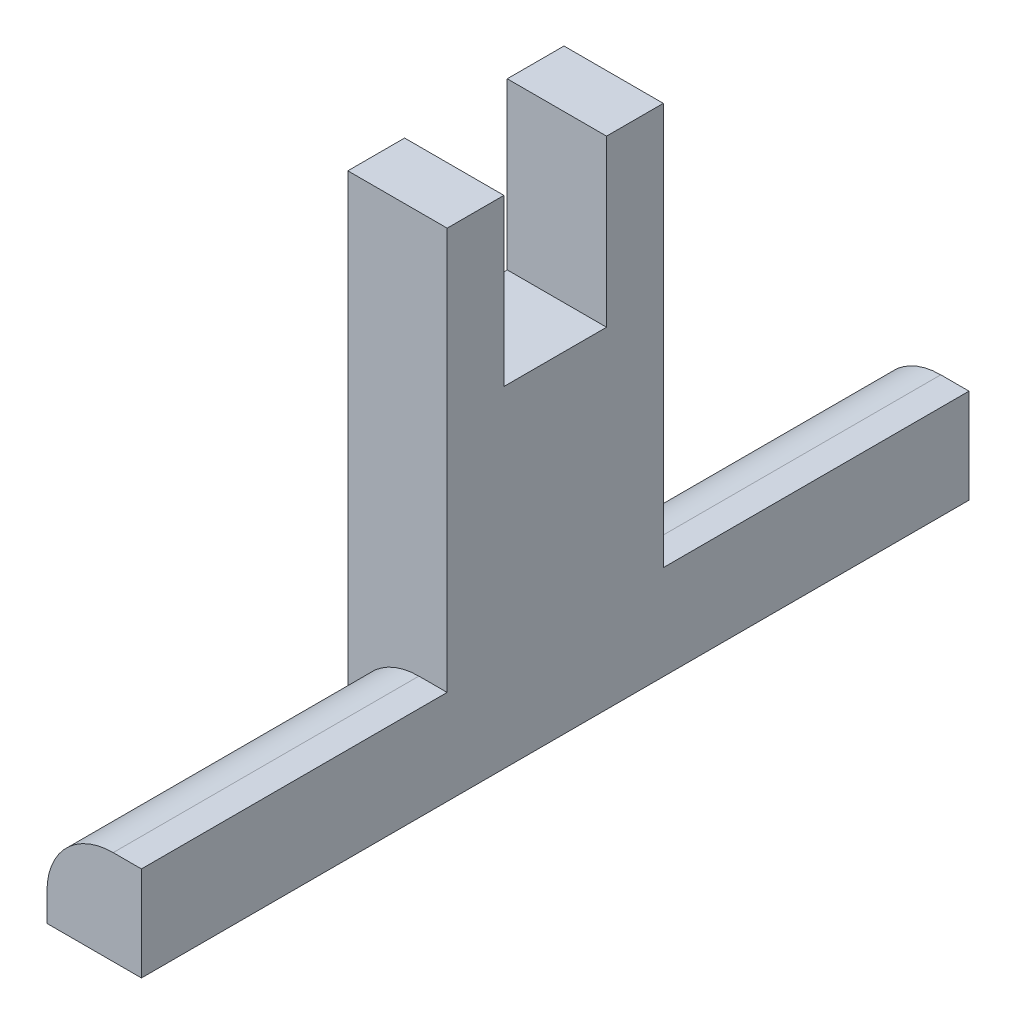
ISO-10303-21;
HEADER;
FILE_DESCRIPTION(('STEP AP214'),'2;1');
FILE_NAME('part.step','',(''),(''),'','','');
FILE_SCHEMA(('AUTOMOTIVE_DESIGN { 1 0 10303 214 1 1 1 1 }'));
ENDSEC;
DATA;
#1=APPLICATION_CONTEXT('core data for automotive mechanical design processes');
#2=APPLICATION_PROTOCOL_DEFINITION('international standard','automotive_design',2000,#1);
#3=PRODUCT_CONTEXT('',#1,'mechanical');
#4=PRODUCT('Part','Part','',(#3));
#5=PRODUCT_RELATED_PRODUCT_CATEGORY('part','',(#4));
#6=PRODUCT_DEFINITION_FORMATION('','',#4);
#7=PRODUCT_DEFINITION_CONTEXT('part definition',#1,'design');
#8=PRODUCT_DEFINITION('design','',#6,#7);
#9=PRODUCT_DEFINITION_SHAPE('','',#8);
#10=(LENGTH_UNIT() NAMED_UNIT(*) SI_UNIT(.MILLI.,.METRE.));
#11=(NAMED_UNIT(*) PLANE_ANGLE_UNIT() SI_UNIT($,.RADIAN.));
#12=(NAMED_UNIT(*) SI_UNIT($,.STERADIAN.) SOLID_ANGLE_UNIT());
#13=UNCERTAINTY_MEASURE_WITH_UNIT(LENGTH_MEASURE(1.E-05),#10,'distance_accuracy_value','');
#14=(GEOMETRIC_REPRESENTATION_CONTEXT(3) GLOBAL_UNCERTAINTY_ASSIGNED_CONTEXT((#13)) GLOBAL_UNIT_ASSIGNED_CONTEXT((#10,
#11,#12)) REPRESENTATION_CONTEXT('',''));
#15=CARTESIAN_POINT('',(0.,0.,0.));
#16=DIRECTION('',(0.,0.,1.));
#17=DIRECTION('',(1.,0.,0.));
#18=AXIS2_PLACEMENT_3D('',#15,#16,#17);
#19=CARTESIAN_POINT('',(-6.,0.,-6.5301128643398));
#20=DIRECTION('',(0.,0.,-1.));
#21=DIRECTION('',(-1.,0.,0.));
#22=AXIS2_PLACEMENT_3D('',#19,#20,#21);
#23=PLANE('',#22);
#24=DIRECTION('',(0.,1.,0.));
#25=VECTOR('',#24,1.);
#26=CARTESIAN_POINT('',(0.,0.,-6.5301128643398));
#27=LINE('',#26,#25);
#28=CARTESIAN_POINT('',(0.,-14.2928085357805,-6.5301128643398));
#29=VERTEX_POINT('',#28);
#30=CARTESIAN_POINT('',(0.,10.,-6.5301128643398));
#31=VERTEX_POINT('',#30);
#32=EDGE_CURVE('E216',#29,#31,#27,.T.);
#33=ORIENTED_EDGE('',*,*,#32,.F.);
#34=DIRECTION('',(-1.,0.,0.));
#35=VECTOR('',#34,1.);
#36=CARTESIAN_POINT('',(-6.,-14.2928085357805,-6.5301128643398));
#37=LINE('',#36,#35);
#38=CARTESIAN_POINT('',(-1.70719146421949,-14.2928085357805,-6.5301128643398));
#39=VERTEX_POINT('',#38);
#40=EDGE_CURVE('E150',#29,#39,#37,.T.);
#41=ORIENTED_EDGE('',*,*,#40,.T.);
#42=CARTESIAN_POINT('',(-1.70719146421949,-18.2928085357805,-6.5301128643398));
#43=DIRECTION('',(0.,0.,-1.));
#44=DIRECTION('',(-1.,0.,0.));
#45=AXIS2_PLACEMENT_3D('',#42,#43,#44);
#46=CIRCLE('',#45,4.);
#47=CARTESIAN_POINT('',(-5.70719146421949,-18.2928085357805,-6.5301128643398));
#48=VERTEX_POINT('',#47);
#49=EDGE_CURVE('E209',#39,#48,#46,.F.);
#50=ORIENTED_EDGE('',*,*,#49,.T.);
#51=DIRECTION('',(0.,-1.,0.));
#52=VECTOR('',#51,1.);
#53=CARTESIAN_POINT('',(-5.70719146421949,0.,-6.5301128643398));
#54=LINE('',#53,#52);
#55=CARTESIAN_POINT('',(-5.70719146421949,-20.,-6.5301128643398));
#56=VERTEX_POINT('',#55);
#57=EDGE_CURVE('E206',#48,#56,#54,.T.);
#58=ORIENTED_EDGE('',*,*,#57,.T.);
#59=DIRECTION('',(1.,0.,0.));
#60=VECTOR('',#59,1.);
#61=CARTESIAN_POINT('',(-6.,-20.,-6.5301128643398));
#62=LINE('',#61,#60);
#63=CARTESIAN_POINT('',(-6.,-20.,-6.5301128643398));
#64=VERTEX_POINT('',#63);
#65=EDGE_CURVE('E255',#64,#56,#62,.T.);
#66=ORIENTED_EDGE('',*,*,#65,.F.);
#67=DIRECTION('',(0.,1.,0.));
#68=VECTOR('',#67,1.);
#69=CARTESIAN_POINT('',(-6.,0.,-6.5301128643398));
#70=LINE('',#69,#68);
#71=CARTESIAN_POINT('',(-6.,10.,-6.5301128643398));
#72=VERTEX_POINT('',#71);
#73=EDGE_CURVE('E231',#64,#72,#70,.T.);
#74=ORIENTED_EDGE('',*,*,#73,.T.);
#75=DIRECTION('',(1.,0.,0.));
#76=VECTOR('',#75,1.);
#77=CARTESIAN_POINT('',(-6.,10.,-6.5301128643398));
#78=LINE('',#77,#76);
#79=EDGE_CURVE('E252',#72,#31,#78,.T.);
#80=ORIENTED_EDGE('',*,*,#79,.T.);
#81=EDGE_LOOP('',(#33,#41,#50,#58,#66,#74,#80));
#82=FACE_BOUND('',#81,.T.);
#83=ADVANCED_FACE('F36',(#82),#23,.T.);
#84=CARTESIAN_POINT('',(-6.,0.,6.5301128643398));
#85=DIRECTION('',(0.,0.,1.));
#86=DIRECTION('',(0.,-1.,0.));
#87=AXIS2_PLACEMENT_3D('',#84,#85,#86);
#88=PLANE('',#87);
#89=CARTESIAN_POINT('',(-1.70719146421949,-18.2928085357805,6.5301128643398));
#90=DIRECTION('',(0.,0.,1.));
#91=DIRECTION('',(0.,-1.,0.));
#92=AXIS2_PLACEMENT_3D('',#89,#90,#91);
#93=CIRCLE('',#92,4.);
#94=CARTESIAN_POINT('',(-5.70719146421949,-18.2928085357805,6.5301128643398));
#95=VERTEX_POINT('',#94);
#96=CARTESIAN_POINT('',(-1.70719146421949,-14.2928085357805,6.5301128643398));
#97=VERTEX_POINT('',#96);
#98=EDGE_CURVE('E11',#95,#97,#93,.F.);
#99=ORIENTED_EDGE('',*,*,#98,.T.);
#100=DIRECTION('',(1.,0.,0.));
#101=VECTOR('',#100,1.);
#102=CARTESIAN_POINT('',(-6.,-14.2928085357805,6.5301128643398));
#103=LINE('',#102,#101);
#104=CARTESIAN_POINT('',(0.,-14.2928085357805,6.5301128643398));
#105=VERTEX_POINT('',#104);
#106=EDGE_CURVE('E203',#97,#105,#103,.T.);
#107=ORIENTED_EDGE('',*,*,#106,.T.);
#108=DIRECTION('',(0.,-1.,0.));
#109=VECTOR('',#108,1.);
#110=CARTESIAN_POINT('',(0.,0.,6.5301128643398));
#111=LINE('',#110,#109);
#112=CARTESIAN_POINT('',(0.,10.,6.5301128643398));
#113=VERTEX_POINT('',#112);
#114=EDGE_CURVE('E247',#113,#105,#111,.T.);
#115=ORIENTED_EDGE('',*,*,#114,.F.);
#116=DIRECTION('',(1.,0.,0.));
#117=VECTOR('',#116,1.);
#118=CARTESIAN_POINT('',(-6.,10.,6.5301128643398));
#119=LINE('',#118,#117);
#120=CARTESIAN_POINT('',(-6.,10.,6.5301128643398));
#121=VERTEX_POINT('',#120);
#122=EDGE_CURVE('E260',#121,#113,#119,.T.);
#123=ORIENTED_EDGE('',*,*,#122,.F.);
#124=DIRECTION('',(0.,-1.,0.));
#125=VECTOR('',#124,1.);
#126=CARTESIAN_POINT('',(-6.,0.,6.5301128643398));
#127=LINE('',#126,#125);
#128=CARTESIAN_POINT('',(-6.,-20.,6.5301128643398));
#129=VERTEX_POINT('',#128);
#130=EDGE_CURVE('E225',#121,#129,#127,.T.);
#131=ORIENTED_EDGE('',*,*,#130,.T.);
#132=DIRECTION('',(1.,0.,0.));
#133=VECTOR('',#132,1.);
#134=CARTESIAN_POINT('',(-6.,-20.,6.5301128643398));
#135=LINE('',#134,#133);
#136=CARTESIAN_POINT('',(-5.70719146421949,-20.,6.5301128643398));
#137=VERTEX_POINT('',#136);
#138=EDGE_CURVE('E258',#129,#137,#135,.T.);
#139=ORIENTED_EDGE('',*,*,#138,.T.);
#140=DIRECTION('',(0.,1.,0.));
#141=VECTOR('',#140,1.);
#142=CARTESIAN_POINT('',(-5.70719146421949,0.,6.5301128643398));
#143=LINE('',#142,#141);
#144=EDGE_CURVE('E44',#137,#95,#143,.T.);
#145=ORIENTED_EDGE('',*,*,#144,.T.);
#146=EDGE_LOOP('',(#99,#107,#115,#123,#131,#139,#145));
#147=FACE_BOUND('',#146,.T.);
#148=ADVANCED_FACE('F295',(#147),#88,.T.);
#149=CARTESIAN_POINT('',(-6.,10.,0.));
#150=DIRECTION('',(0.,-1.,0.));
#151=DIRECTION('',(0.,0.,-1.));
#152=AXIS2_PLACEMENT_3D('',#149,#150,#151);
#153=PLANE('',#152);
#154=DIRECTION('',(0.,0.,-1.));
#155=VECTOR('',#154,1.);
#156=CARTESIAN_POINT('',(0.,10.,0.));
#157=LINE('',#156,#155);
#158=CARTESIAN_POINT('',(0.,10.,-3.1));
#159=VERTEX_POINT('',#158);
#160=EDGE_CURVE('E212',#159,#31,#157,.T.);
#161=ORIENTED_EDGE('',*,*,#160,.T.);
#162=ORIENTED_EDGE('',*,*,#79,.F.);
#163=DIRECTION('',(0.,0.,-1.));
#164=VECTOR('',#163,1.);
#165=CARTESIAN_POINT('',(-6.,10.,0.));
#166=LINE('',#165,#164);
#167=CARTESIAN_POINT('',(-6.,10.,-3.1));
#168=VERTEX_POINT('',#167);
#169=EDGE_CURVE('E213',#168,#72,#166,.T.);
#170=ORIENTED_EDGE('',*,*,#169,.F.);
#171=DIRECTION('',(1.,0.,0.));
#172=VECTOR('',#171,1.);
#173=CARTESIAN_POINT('',(-6.,10.,-3.1));
#174=LINE('',#173,#172);
#175=EDGE_CURVE('E234',#168,#159,#174,.T.);
#176=ORIENTED_EDGE('',*,*,#175,.T.);
#177=EDGE_LOOP('',(#161,#162,#170,#176));
#178=FACE_BOUND('',#177,.T.);
#179=ADVANCED_FACE('F38',(#178),#153,.F.);
#180=CARTESIAN_POINT('',(-6.,-20.,0.));
#181=DIRECTION('',(0.,-1.,0.));
#182=DIRECTION('',(0.,0.,-1.));
#183=AXIS2_PLACEMENT_3D('',#180,#181,#182);
#184=PLANE('',#183);
#185=DIRECTION('',(0.,0.,-1.));
#186=VECTOR('',#185,1.);
#187=CARTESIAN_POINT('',(-5.70719146421949,-20.,25.));
#188=LINE('',#187,#186);
#189=CARTESIAN_POINT('',(-5.70719146421949,-20.,25.));
#190=VERTEX_POINT('',#189);
#191=EDGE_CURVE('E192',#190,#137,#188,.T.);
#192=ORIENTED_EDGE('',*,*,#191,.T.);
#193=ORIENTED_EDGE('',*,*,#138,.F.);
#194=DIRECTION('',(0.,0.,-1.));
#195=VECTOR('',#194,1.);
#196=CARTESIAN_POINT('',(-6.,-20.,0.));
#197=LINE('',#196,#195);
#198=EDGE_CURVE('E228',#129,#64,#197,.T.);
#199=ORIENTED_EDGE('',*,*,#198,.T.);
#200=ORIENTED_EDGE('',*,*,#65,.T.);
#201=CARTESIAN_POINT('',(-5.70719146421949,-20.,-25.));
#202=VERTEX_POINT('',#201);
#203=EDGE_CURVE('E191',#56,#202,#188,.T.);
#204=ORIENTED_EDGE('',*,*,#203,.T.);
#205=DIRECTION('',(1.,0.,0.));
#206=VECTOR('',#205,1.);
#207=CARTESIAN_POINT('',(0.,-20.,-25.));
#208=LINE('',#207,#206);
#209=CARTESIAN_POINT('',(0.,-20.,-25.));
#210=VERTEX_POINT('',#209);
#211=EDGE_CURVE('E177',#202,#210,#208,.T.);
#212=ORIENTED_EDGE('',*,*,#211,.T.);
#213=DIRECTION('',(0.,0.,-1.));
#214=VECTOR('',#213,1.);
#215=CARTESIAN_POINT('',(0.,-20.,0.));
#216=LINE('',#215,#214);
#217=CARTESIAN_POINT('',(0.,-20.,25.));
#218=VERTEX_POINT('',#217);
#219=EDGE_CURVE('E170',#218,#210,#216,.T.);
#220=ORIENTED_EDGE('',*,*,#219,.F.);
#221=DIRECTION('',(1.,0.,0.));
#222=VECTOR('',#221,1.);
#223=CARTESIAN_POINT('',(0.,-20.,25.));
#224=LINE('',#223,#222);
#225=EDGE_CURVE('E188',#190,#218,#224,.T.);
#226=ORIENTED_EDGE('',*,*,#225,.F.);
#227=EDGE_LOOP('',(#192,#193,#199,#200,#204,#212,#220,#226));
#228=FACE_BOUND('',#227,.T.);
#229=ADVANCED_FACE('F307',(#228),#184,.T.);
#230=CARTESIAN_POINT('',(-6.,10.,0.));
#231=DIRECTION('',(0.,-1.,0.));
#232=DIRECTION('',(0.,0.,-1.));
#233=AXIS2_PLACEMENT_3D('',#230,#231,#232);
#234=PLANE('',#233);
#235=DIRECTION('',(0.,0.,-1.));
#236=VECTOR('',#235,1.);
#237=CARTESIAN_POINT('',(0.,10.,0.));
#238=LINE('',#237,#236);
#239=CARTESIAN_POINT('',(0.,10.,3.1));
#240=VERTEX_POINT('',#239);
#241=EDGE_CURVE('E245',#113,#240,#238,.T.);
#242=ORIENTED_EDGE('',*,*,#241,.T.);
#243=DIRECTION('',(1.,0.,0.));
#244=VECTOR('',#243,1.);
#245=CARTESIAN_POINT('',(-6.,10.,3.1));
#246=LINE('',#245,#244);
#247=CARTESIAN_POINT('',(-6.,10.,3.1));
#248=VERTEX_POINT('',#247);
#249=EDGE_CURVE('E262',#248,#240,#246,.T.);
#250=ORIENTED_EDGE('',*,*,#249,.F.);
#251=DIRECTION('',(0.,0.,-1.));
#252=VECTOR('',#251,1.);
#253=CARTESIAN_POINT('',(-6.,10.,0.));
#254=LINE('',#253,#252);
#255=EDGE_CURVE('E223',#121,#248,#254,.T.);
#256=ORIENTED_EDGE('',*,*,#255,.F.);
#257=ORIENTED_EDGE('',*,*,#122,.T.);
#258=EDGE_LOOP('',(#242,#250,#256,#257));
#259=FACE_BOUND('',#258,.T.);
#260=ADVANCED_FACE('F293',(#259),#234,.F.);
#261=CARTESIAN_POINT('',(-6.,0.,3.1));
#262=DIRECTION('',(0.,0.,1.));
#263=DIRECTION('',(0.,-1.,0.));
#264=AXIS2_PLACEMENT_3D('',#261,#262,#263);
#265=PLANE('',#264);
#266=DIRECTION('',(0.,-1.,0.));
#267=VECTOR('',#266,1.);
#268=CARTESIAN_POINT('',(0.,0.,3.1));
#269=LINE('',#268,#267);
#270=CARTESIAN_POINT('',(0.,0.,3.1));
#271=VERTEX_POINT('',#270);
#272=EDGE_CURVE('E243',#240,#271,#269,.T.);
#273=ORIENTED_EDGE('',*,*,#272,.T.);
#274=DIRECTION('',(1.,0.,0.));
#275=VECTOR('',#274,1.);
#276=CARTESIAN_POINT('',(-6.,0.,3.1));
#277=LINE('',#276,#275);
#278=CARTESIAN_POINT('',(-6.,0.,3.1));
#279=VERTEX_POINT('',#278);
#280=EDGE_CURVE('E265',#279,#271,#277,.T.);
#281=ORIENTED_EDGE('',*,*,#280,.F.);
#282=DIRECTION('',(0.,-1.,0.));
#283=VECTOR('',#282,1.);
#284=CARTESIAN_POINT('',(-6.,0.,3.1));
#285=LINE('',#284,#283);
#286=EDGE_CURVE('E221',#248,#279,#285,.T.);
#287=ORIENTED_EDGE('',*,*,#286,.F.);
#288=ORIENTED_EDGE('',*,*,#249,.T.);
#289=EDGE_LOOP('',(#273,#281,#287,#288));
#290=FACE_BOUND('',#289,.T.);
#291=ADVANCED_FACE('F288',(#290),#265,.F.);
#292=CARTESIAN_POINT('',(-6.,0.,0.));
#293=DIRECTION('',(0.,-1.,0.));
#294=DIRECTION('',(0.,0.,-1.));
#295=AXIS2_PLACEMENT_3D('',#292,#293,#294);
#296=PLANE('',#295);
#297=DIRECTION('',(0.,0.,-1.));
#298=VECTOR('',#297,1.);
#299=CARTESIAN_POINT('',(0.,0.,0.));
#300=LINE('',#299,#298);
#301=CARTESIAN_POINT('',(0.,0.,-3.1));
#302=VERTEX_POINT('',#301);
#303=EDGE_CURVE('E240',#271,#302,#300,.T.);
#304=ORIENTED_EDGE('',*,*,#303,.T.);
#305=DIRECTION('',(1.,0.,0.));
#306=VECTOR('',#305,1.);
#307=CARTESIAN_POINT('',(-6.,0.,-3.1));
#308=LINE('',#307,#306);
#309=CARTESIAN_POINT('',(-6.,0.,-3.1));
#310=VERTEX_POINT('',#309);
#311=EDGE_CURVE('E268',#310,#302,#308,.T.);
#312=ORIENTED_EDGE('',*,*,#311,.F.);
#313=DIRECTION('',(0.,0.,-1.));
#314=VECTOR('',#313,1.);
#315=CARTESIAN_POINT('',(-6.,0.,0.));
#316=LINE('',#315,#314);
#317=EDGE_CURVE('E219',#279,#310,#316,.T.);
#318=ORIENTED_EDGE('',*,*,#317,.F.);
#319=ORIENTED_EDGE('',*,*,#280,.T.);
#320=EDGE_LOOP('',(#304,#312,#318,#319));
#321=FACE_BOUND('',#320,.T.);
#322=ADVANCED_FACE('F282',(#321),#296,.F.);
#323=CARTESIAN_POINT('',(-6.,0.,-3.1));
#324=DIRECTION('',(0.,0.,1.));
#325=DIRECTION('',(0.,-1.,0.));
#326=AXIS2_PLACEMENT_3D('',#323,#324,#325);
#327=PLANE('',#326);
#328=DIRECTION('',(0.,-1.,0.));
#329=VECTOR('',#328,1.);
#330=CARTESIAN_POINT('',(0.,0.,-3.1));
#331=LINE('',#330,#329);
#332=EDGE_CURVE('E237',#159,#302,#331,.T.);
#333=ORIENTED_EDGE('',*,*,#332,.F.);
#334=ORIENTED_EDGE('',*,*,#175,.F.);
#335=DIRECTION('',(0.,-1.,0.));
#336=VECTOR('',#335,1.);
#337=CARTESIAN_POINT('',(-6.,0.,-3.1));
#338=LINE('',#337,#336);
#339=EDGE_CURVE('E215',#168,#310,#338,.T.);
#340=ORIENTED_EDGE('',*,*,#339,.T.);
#341=ORIENTED_EDGE('',*,*,#311,.T.);
#342=EDGE_LOOP('',(#333,#334,#340,#341));
#343=FACE_BOUND('',#342,.T.);
#344=ADVANCED_FACE('F278',(#343),#327,.T.);
#345=CARTESIAN_POINT('',(-6.,0.,0.));
#346=DIRECTION('',(1.,0.,0.));
#347=DIRECTION('',(0.,0.,-1.));
#348=AXIS2_PLACEMENT_3D('',#345,#346,#347);
#349=PLANE('',#348);
#350=ORIENTED_EDGE('',*,*,#169,.T.);
#351=ORIENTED_EDGE('',*,*,#73,.F.);
#352=ORIENTED_EDGE('',*,*,#198,.F.);
#353=ORIENTED_EDGE('',*,*,#130,.F.);
#354=ORIENTED_EDGE('',*,*,#255,.T.);
#355=ORIENTED_EDGE('',*,*,#286,.T.);
#356=ORIENTED_EDGE('',*,*,#317,.T.);
#357=ORIENTED_EDGE('',*,*,#339,.F.);
#358=EDGE_LOOP('',(#350,#351,#352,#353,#354,#355,#356,#357));
#359=FACE_BOUND('',#358,.T.);
#360=ADVANCED_FACE('F316',(#359),#349,.F.);
#361=CARTESIAN_POINT('',(0.,0.,0.));
#362=DIRECTION('',(1.,0.,0.));
#363=DIRECTION('',(0.,0.,-1.));
#364=AXIS2_PLACEMENT_3D('',#361,#362,#363);
#365=PLANE('',#364);
#366=ORIENTED_EDGE('',*,*,#219,.T.);
#367=DIRECTION('',(0.,1.,0.));
#368=VECTOR('',#367,1.);
#369=CARTESIAN_POINT('',(0.,-20.,-25.));
#370=LINE('',#369,#368);
#371=CARTESIAN_POINT('',(0.,-14.2928085357805,-25.));
#372=VERTEX_POINT('',#371);
#373=EDGE_CURVE('E162',#210,#372,#370,.T.);
#374=ORIENTED_EDGE('',*,*,#373,.T.);
#375=DIRECTION('',(0.,0.,-1.));
#376=VECTOR('',#375,1.);
#377=CARTESIAN_POINT('',(0.,-14.2928085357805,25.));
#378=LINE('',#377,#376);
#379=EDGE_CURVE('E144',#29,#372,#378,.T.);
#380=ORIENTED_EDGE('',*,*,#379,.F.);
#381=ORIENTED_EDGE('',*,*,#32,.T.);
#382=ORIENTED_EDGE('',*,*,#160,.F.);
#383=ORIENTED_EDGE('',*,*,#332,.T.);
#384=ORIENTED_EDGE('',*,*,#303,.F.);
#385=ORIENTED_EDGE('',*,*,#272,.F.);
#386=ORIENTED_EDGE('',*,*,#241,.F.);
#387=ORIENTED_EDGE('',*,*,#114,.T.);
#388=CARTESIAN_POINT('',(0.,-14.2928085357805,25.));
#389=VERTEX_POINT('',#388);
#390=EDGE_CURVE('E154',#389,#105,#378,.T.);
#391=ORIENTED_EDGE('',*,*,#390,.F.);
#392=DIRECTION('',(0.,1.,0.));
#393=VECTOR('',#392,1.);
#394=CARTESIAN_POINT('',(0.,-20.,25.));
#395=LINE('',#394,#393);
#396=EDGE_CURVE('E179',#218,#389,#395,.T.);
#397=ORIENTED_EDGE('',*,*,#396,.F.);
#398=EDGE_LOOP('',(#366,#374,#380,#381,#382,#383,#384,#385,#386,#387,#391,#397));
#399=FACE_BOUND('',#398,.T.);
#400=ADVANCED_FACE('F168',(#399),#365,.T.);
#401=CARTESIAN_POINT('',(-1.70719146421949,-18.2928085357805,25.));
#402=DIRECTION('',(0.,0.,-1.));
#403=DIRECTION('',(-1.,0.,0.));
#404=AXIS2_PLACEMENT_3D('',#401,#402,#403);
#405=PLANE('',#404);
#406=ORIENTED_EDGE('',*,*,#396,.T.);
#407=DIRECTION('',(-1.,0.,0.));
#408=VECTOR('',#407,1.);
#409=CARTESIAN_POINT('',(0.,-14.2928085357805,25.));
#410=LINE('',#409,#408);
#411=CARTESIAN_POINT('',(-1.70719146421949,-14.2928085357805,25.));
#412=VERTEX_POINT('',#411);
#413=EDGE_CURVE('E182',#389,#412,#410,.T.);
#414=ORIENTED_EDGE('',*,*,#413,.T.);
#415=CARTESIAN_POINT('',(-1.70719146421949,-18.2928085357805,25.));
#416=DIRECTION('',(0.,0.,1.));
#417=DIRECTION('',(-1.,0.,0.));
#418=AXIS2_PLACEMENT_3D('',#415,#416,#417);
#419=CIRCLE('',#418,4.);
#420=CARTESIAN_POINT('',(-5.70719146421949,-18.2928085357805,25.));
#421=VERTEX_POINT('',#420);
#422=EDGE_CURVE('E184',#412,#421,#419,.T.);
#423=ORIENTED_EDGE('',*,*,#422,.T.);
#424=DIRECTION('',(0.,-1.,0.));
#425=VECTOR('',#424,1.);
#426=CARTESIAN_POINT('',(-5.70719146421949,-20.,25.));
#427=LINE('',#426,#425);
#428=EDGE_CURVE('E186',#421,#190,#427,.T.);
#429=ORIENTED_EDGE('',*,*,#428,.T.);
#430=ORIENTED_EDGE('',*,*,#225,.T.);
#431=EDGE_LOOP('',(#406,#414,#423,#429,#430));
#432=FACE_BOUND('',#431,.T.);
#433=ADVANCED_FACE('F302',(#432),#405,.F.);
#434=CARTESIAN_POINT('',(-5.70719146421949,-20.,25.));
#435=DIRECTION('',(1.,0.,0.));
#436=DIRECTION('',(0.,0.,-1.));
#437=AXIS2_PLACEMENT_3D('',#434,#435,#436);
#438=PLANE('',#437);
#439=ORIENTED_EDGE('',*,*,#144,.F.);
#440=ORIENTED_EDGE('',*,*,#191,.F.);
#441=ORIENTED_EDGE('',*,*,#428,.F.);
#442=DIRECTION('',(0.,0.,-1.));
#443=VECTOR('',#442,1.);
#444=CARTESIAN_POINT('',(-5.70719146421949,-18.2928085357805,25.));
#445=LINE('',#444,#443);
#446=EDGE_CURVE('E196',#421,#95,#445,.T.);
#447=ORIENTED_EDGE('',*,*,#446,.T.);
#448=EDGE_LOOP('',(#439,#440,#441,#447));
#449=FACE_BOUND('',#448,.T.);
#450=ADVANCED_FACE('F318',(#449),#438,.F.);
#451=CARTESIAN_POINT('',(-1.70719146421949,-18.2928085357805,25.));
#452=DIRECTION('',(0.,0.,-1.));
#453=DIRECTION('',(-1.,0.,0.));
#454=AXIS2_PLACEMENT_3D('',#451,#452,#453);
#455=CYLINDRICAL_SURFACE('',#454,4.);
#456=ORIENTED_EDGE('',*,*,#98,.F.);
#457=ORIENTED_EDGE('',*,*,#446,.F.);
#458=ORIENTED_EDGE('',*,*,#422,.F.);
#459=DIRECTION('',(0.,0.,-1.));
#460=VECTOR('',#459,1.);
#461=CARTESIAN_POINT('',(-1.70719146421949,-14.2928085357805,25.));
#462=LINE('',#461,#460);
#463=EDGE_CURVE('E155',#412,#97,#462,.T.);
#464=ORIENTED_EDGE('',*,*,#463,.T.);
#465=EDGE_LOOP('',(#456,#457,#458,#464));
#466=FACE_BOUND('',#465,.T.);
#467=ADVANCED_FACE('F321',(#466),#455,.T.);
#468=CARTESIAN_POINT('',(0.,-14.2928085357805,25.));
#469=DIRECTION('',(0.,-1.,0.));
#470=DIRECTION('',(0.,0.,-1.));
#471=AXIS2_PLACEMENT_3D('',#468,#469,#470);
#472=PLANE('',#471);
#473=ORIENTED_EDGE('',*,*,#106,.F.);
#474=ORIENTED_EDGE('',*,*,#463,.F.);
#475=ORIENTED_EDGE('',*,*,#413,.F.);
#476=ORIENTED_EDGE('',*,*,#390,.T.);
#477=EDGE_LOOP('',(#473,#474,#475,#476));
#478=FACE_BOUND('',#477,.T.);
#479=ADVANCED_FACE('F298',(#478),#472,.F.);
#480=ORIENTED_EDGE('',*,*,#49,.F.);
#481=CARTESIAN_POINT('',(-1.70719146421949,-14.2928085357805,-25.));
#482=VERTEX_POINT('',#481);
#483=EDGE_CURVE('E199',#39,#482,#462,.T.);
#484=ORIENTED_EDGE('',*,*,#483,.T.);
#485=CARTESIAN_POINT('',(-1.70719146421949,-18.2928085357805,-25.));
#486=DIRECTION('',(0.,0.,1.));
#487=DIRECTION('',(-1.,0.,0.));
#488=AXIS2_PLACEMENT_3D('',#485,#486,#487);
#489=CIRCLE('',#488,4.);
#490=CARTESIAN_POINT('',(-5.70719146421949,-18.2928085357805,-25.));
#491=VERTEX_POINT('',#490);
#492=EDGE_CURVE('E166',#482,#491,#489,.T.);
#493=ORIENTED_EDGE('',*,*,#492,.T.);
#494=EDGE_CURVE('E195',#48,#491,#445,.T.);
#495=ORIENTED_EDGE('',*,*,#494,.F.);
#496=EDGE_LOOP('',(#480,#484,#493,#495));
#497=FACE_BOUND('',#496,.T.);
#498=ADVANCED_FACE('F311',(#497),#455,.T.);
#499=ORIENTED_EDGE('',*,*,#57,.F.);
#500=ORIENTED_EDGE('',*,*,#494,.T.);
#501=DIRECTION('',(0.,-1.,0.));
#502=VECTOR('',#501,1.);
#503=CARTESIAN_POINT('',(-5.70719146421949,-20.,-25.));
#504=LINE('',#503,#502);
#505=EDGE_CURVE('E174',#491,#202,#504,.T.);
#506=ORIENTED_EDGE('',*,*,#505,.T.);
#507=ORIENTED_EDGE('',*,*,#203,.F.);
#508=EDGE_LOOP('',(#499,#500,#506,#507));
#509=FACE_BOUND('',#508,.T.);
#510=ADVANCED_FACE('F330',(#509),#438,.F.);
#511=ORIENTED_EDGE('',*,*,#40,.F.);
#512=ORIENTED_EDGE('',*,*,#379,.T.);
#513=DIRECTION('',(-1.,0.,0.));
#514=VECTOR('',#513,1.);
#515=CARTESIAN_POINT('',(0.,-14.2928085357805,-25.));
#516=LINE('',#515,#514);
#517=EDGE_CURVE('E148',#372,#482,#516,.T.);
#518=ORIENTED_EDGE('',*,*,#517,.T.);
#519=ORIENTED_EDGE('',*,*,#483,.F.);
#520=EDGE_LOOP('',(#511,#512,#518,#519));
#521=FACE_BOUND('',#520,.T.);
#522=ADVANCED_FACE('F146',(#521),#472,.F.);
#523=CARTESIAN_POINT('',(-1.70719146421949,-18.2928085357805,-25.));
#524=DIRECTION('',(0.,0.,-1.));
#525=DIRECTION('',(-1.,0.,0.));
#526=AXIS2_PLACEMENT_3D('',#523,#524,#525);
#527=PLANE('',#526);
#528=ORIENTED_EDGE('',*,*,#373,.F.);
#529=ORIENTED_EDGE('',*,*,#211,.F.);
#530=ORIENTED_EDGE('',*,*,#505,.F.);
#531=ORIENTED_EDGE('',*,*,#492,.F.);
#532=ORIENTED_EDGE('',*,*,#517,.F.);
#533=EDGE_LOOP('',(#528,#529,#530,#531,#532));
#534=FACE_BOUND('',#533,.T.);
#535=ADVANCED_FACE('F160',(#534),#527,.T.);
#536=CLOSED_SHELL('',(#83,#148,#179,#229,#260,#291,#322,#344,#360,#400,#433,#450,#467,#479,#498,
#510,#522,#535));
#537=MANIFOLD_SOLID_BREP('B2',#536);
#538=ADVANCED_BREP_SHAPE_REPRESENTATION('',(#18,#537),#14);
#539=SHAPE_DEFINITION_REPRESENTATION(#9,#538);
ENDSEC;
END-ISO-10303-21;
